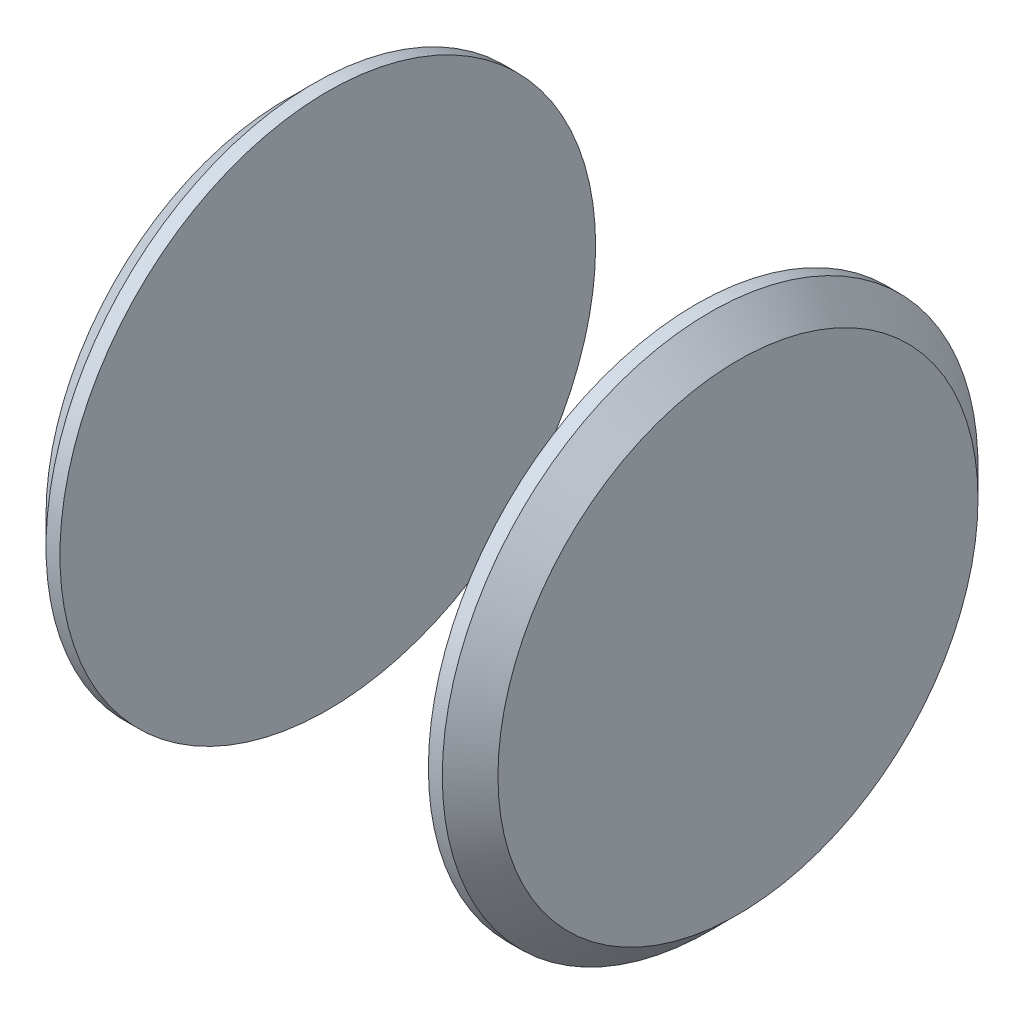
ISO-10303-21;
HEADER;
FILE_DESCRIPTION(('STEP AP214'),'2;1');
FILE_NAME('part.step','',(''),(''),'','','');
FILE_SCHEMA(('AUTOMOTIVE_DESIGN { 1 0 10303 214 1 1 1 1 }'));
ENDSEC;
DATA;
#1=APPLICATION_CONTEXT('core data for automotive mechanical design processes');
#2=APPLICATION_PROTOCOL_DEFINITION('international standard','automotive_design',2000,#1);
#3=PRODUCT_CONTEXT('',#1,'mechanical');
#4=PRODUCT('Part','Part','',(#3));
#5=PRODUCT_RELATED_PRODUCT_CATEGORY('part','',(#4));
#6=PRODUCT_DEFINITION_FORMATION('','',#4);
#7=PRODUCT_DEFINITION_CONTEXT('part definition',#1,'design');
#8=PRODUCT_DEFINITION('design','',#6,#7);
#9=PRODUCT_DEFINITION_SHAPE('','',#8);
#10=(LENGTH_UNIT() NAMED_UNIT(*) SI_UNIT(.MILLI.,.METRE.));
#11=(NAMED_UNIT(*) PLANE_ANGLE_UNIT() SI_UNIT($,.RADIAN.));
#12=(NAMED_UNIT(*) SI_UNIT($,.STERADIAN.) SOLID_ANGLE_UNIT());
#13=UNCERTAINTY_MEASURE_WITH_UNIT(LENGTH_MEASURE(1.E-05),#10,'distance_accuracy_value','');
#14=(GEOMETRIC_REPRESENTATION_CONTEXT(3) GLOBAL_UNCERTAINTY_ASSIGNED_CONTEXT((#13)) GLOBAL_UNIT_ASSIGNED_CONTEXT((#10,
#11,#12)) REPRESENTATION_CONTEXT('',''));
#15=CARTESIAN_POINT('',(0.,0.,0.));
#16=DIRECTION('',(0.,0.,1.));
#17=DIRECTION('',(1.,0.,0.));
#18=AXIS2_PLACEMENT_3D('',#15,#16,#17);
#19=CARTESIAN_POINT('',(173.6852,-77.7875,749.3));
#20=DIRECTION('',(-1.,0.,0.));
#21=DIRECTION('',(0.,0.,1.));
#22=AXIS2_PLACEMENT_3D('',#19,#20,#21);
#23=CYLINDRICAL_SURFACE('',#22,24.4475);
#24=CARTESIAN_POINT('',(172.4152,-77.7875,749.3));
#25=DIRECTION('',(1.,0.,0.));
#26=DIRECTION('',(0.,0.,-1.));
#27=AXIS2_PLACEMENT_3D('',#24,#25,#26);
#28=CIRCLE('',#27,24.4475);
#29=CARTESIAN_POINT('',(172.4152,-77.7875,724.8525));
#30=VERTEX_POINT('',#29);
#31=EDGE_CURVE('P0_E23',#30,#30,#28,.T.);
#32=ORIENTED_EDGE('',*,*,#31,.T.);
#33=EDGE_LOOP('',(#32));
#34=FACE_BOUND('',#33,.T.);
#35=CARTESIAN_POINT('',(173.6852,-77.7875,749.3));
#36=DIRECTION('',(1.,0.,0.));
#37=DIRECTION('',(0.,0.,-1.));
#38=AXIS2_PLACEMENT_3D('',#35,#36,#37);
#39=CIRCLE('',#38,24.4475);
#40=CARTESIAN_POINT('',(173.6852,-77.7875,724.8525));
#41=VERTEX_POINT('',#40);
#42=EDGE_CURVE('P0_E27',#41,#41,#39,.T.);
#43=ORIENTED_EDGE('',*,*,#42,.F.);
#44=EDGE_LOOP('',(#43));
#45=FACE_BOUND('',#44,.T.);
#46=ADVANCED_FACE('P0_F15',(#34,#45),#23,.T.);
#47=CARTESIAN_POINT('',(173.6852,-76.5175,749.3));
#48=DIRECTION('',(1.,0.,0.));
#49=DIRECTION('',(0.,1.,0.));
#50=AXIS2_PLACEMENT_3D('',#47,#48,#49);
#51=PLANE('',#50);
#52=ORIENTED_EDGE('',*,*,#42,.T.);
#53=EDGE_LOOP('',(#52));
#54=FACE_BOUND('',#53,.T.);
#55=ADVANCED_FACE('P0_F34',(#54),#51,.T.);
#56=CARTESIAN_POINT('',(169.8752,-76.5175,749.3));
#57=DIRECTION('',(1.,0.,0.));
#58=DIRECTION('',(0.,1.,0.));
#59=AXIS2_PLACEMENT_3D('',#56,#57,#58);
#60=PLANE('',#59);
#61=CARTESIAN_POINT('',(169.8752,-77.7875,749.3));
#62=DIRECTION('',(1.,0.,0.));
#63=DIRECTION('',(0.,0.,-1.));
#64=AXIS2_PLACEMENT_3D('',#61,#62,#63);
#65=CIRCLE('',#64,21.9075);
#66=CARTESIAN_POINT('',(169.8752,-77.7875,727.3925));
#67=VERTEX_POINT('',#66);
#68=EDGE_CURVE('P0_E10',#67,#67,#65,.F.);
#69=ORIENTED_EDGE('',*,*,#68,.T.);
#70=EDGE_LOOP('',(#69));
#71=FACE_BOUND('',#70,.T.);
#72=ADVANCED_FACE('P0_F41',(#71),#60,.F.);
#73=CARTESIAN_POINT('',(172.4152,-77.7875,749.3));
#74=DIRECTION('',(1.,0.,0.));
#75=DIRECTION('',(0.,0.,-1.));
#76=AXIS2_PLACEMENT_3D('',#73,#74,#75);
#77=CONICAL_SURFACE('',#76,24.4475,0.785398163397453);
#78=ORIENTED_EDGE('',*,*,#68,.F.);
#79=EDGE_LOOP('',(#78));
#80=FACE_BOUND('',#79,.T.);
#81=ORIENTED_EDGE('',*,*,#31,.F.);
#82=EDGE_LOOP('',(#81));
#83=FACE_BOUND('',#82,.T.);
#84=ADVANCED_FACE('P0_F18',(#80,#83),#77,.T.);
#85=CLOSED_SHELL('',(#46,#55,#72,#84));
#86=MANIFOLD_SOLID_BREP('P0_B1',#85);
#87=CARTESIAN_POINT('',(207.3148,-77.7875,749.3));
#88=DIRECTION('',(1.,0.,0.));
#89=DIRECTION('',(0.,0.,1.));
#90=AXIS2_PLACEMENT_3D('',#87,#88,#89);
#91=CYLINDRICAL_SURFACE('',#90,24.4475);
#92=CARTESIAN_POINT('',(208.5848,-77.7875,749.3));
#93=DIRECTION('',(-1.,0.,0.));
#94=DIRECTION('',(0.,0.,1.));
#95=AXIS2_PLACEMENT_3D('',#92,#93,#94);
#96=CIRCLE('',#95,24.4475);
#97=CARTESIAN_POINT('',(208.5848,-77.7875,773.7475));
#98=VERTEX_POINT('',#97);
#99=EDGE_CURVE('P1_E10',#98,#98,#96,.T.);
#100=ORIENTED_EDGE('',*,*,#99,.T.);
#101=EDGE_LOOP('',(#100));
#102=FACE_BOUND('',#101,.T.);
#103=CARTESIAN_POINT('',(207.3148,-77.7875,749.3));
#104=DIRECTION('',(1.,0.,0.));
#105=DIRECTION('',(0.,0.,-1.));
#106=AXIS2_PLACEMENT_3D('',#103,#104,#105);
#107=CIRCLE('',#106,24.4475);
#108=CARTESIAN_POINT('',(207.3148,-77.7875,724.8525));
#109=VERTEX_POINT('',#108);
#110=EDGE_CURVE('P1_E27',#109,#109,#107,.T.);
#111=ORIENTED_EDGE('',*,*,#110,.T.);
#112=EDGE_LOOP('',(#111));
#113=FACE_BOUND('',#112,.T.);
#114=ADVANCED_FACE('P1_F15',(#102,#113),#91,.T.);
#115=CARTESIAN_POINT('',(207.3148,-76.5175,749.3));
#116=DIRECTION('',(-1.,0.,0.));
#117=DIRECTION('',(0.,1.,0.));
#118=AXIS2_PLACEMENT_3D('',#115,#116,#117);
#119=PLANE('',#118);
#120=ORIENTED_EDGE('',*,*,#110,.F.);
#121=EDGE_LOOP('',(#120));
#122=FACE_BOUND('',#121,.T.);
#123=ADVANCED_FACE('P1_F35',(#122),#119,.T.);
#124=CARTESIAN_POINT('',(211.1248,-76.5175,749.3));
#125=DIRECTION('',(-1.,0.,0.));
#126=DIRECTION('',(0.,1.,0.));
#127=AXIS2_PLACEMENT_3D('',#124,#125,#126);
#128=PLANE('',#127);
#129=CARTESIAN_POINT('',(211.1248,-77.7875,749.3));
#130=DIRECTION('',(-1.,0.,0.));
#131=DIRECTION('',(0.,0.,1.));
#132=AXIS2_PLACEMENT_3D('',#129,#130,#131);
#133=CIRCLE('',#132,21.9075);
#134=CARTESIAN_POINT('',(211.1248,-77.7875,771.2075));
#135=VERTEX_POINT('',#134);
#136=EDGE_CURVE('P1_E23',#135,#135,#133,.F.);
#137=ORIENTED_EDGE('',*,*,#136,.T.);
#138=EDGE_LOOP('',(#137));
#139=FACE_BOUND('',#138,.T.);
#140=ADVANCED_FACE('P1_F37',(#139),#128,.F.);
#141=CARTESIAN_POINT('',(211.1248,-77.7875,749.3));
#142=DIRECTION('',(-1.,0.,0.));
#143=DIRECTION('',(0.,0.,1.));
#144=AXIS2_PLACEMENT_3D('',#141,#142,#143);
#145=CONICAL_SURFACE('',#144,21.9075,0.785398163397453);
#146=ORIENTED_EDGE('',*,*,#99,.F.);
#147=EDGE_LOOP('',(#146));
#148=FACE_BOUND('',#147,.T.);
#149=ORIENTED_EDGE('',*,*,#136,.F.);
#150=EDGE_LOOP('',(#149));
#151=FACE_BOUND('',#150,.T.);
#152=ADVANCED_FACE('P1_F18',(#148,#151),#145,.T.);
#153=CLOSED_SHELL('',(#114,#123,#140,#152));
#154=MANIFOLD_SOLID_BREP('P1_B1',#153);
#155=ADVANCED_BREP_SHAPE_REPRESENTATION('',(#18,#86,#154),#14);
#156=SHAPE_DEFINITION_REPRESENTATION(#9,#155);
ENDSEC;
END-ISO-10303-21;
